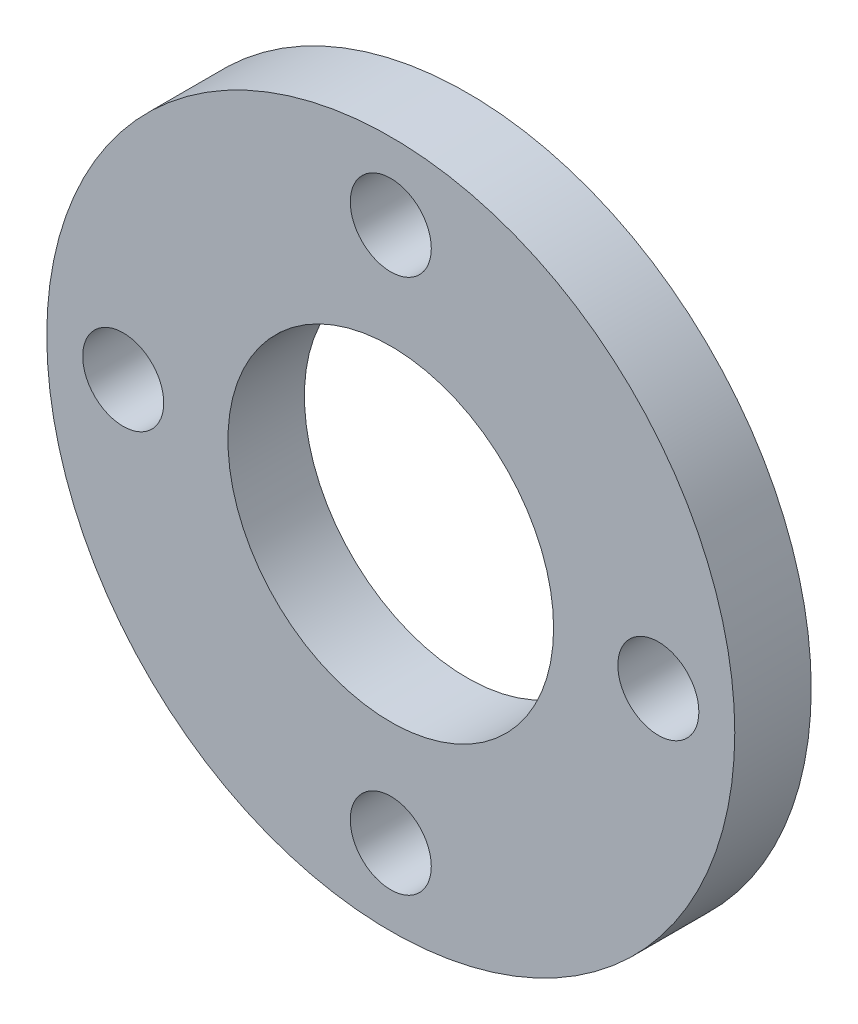
ISO-10303-21;
HEADER;
FILE_DESCRIPTION(('STEP AP214'),'2;1');
FILE_NAME('part.step','',(''),(''),'','','');
FILE_SCHEMA(('AUTOMOTIVE_DESIGN { 1 0 10303 214 1 1 1 1 }'));
ENDSEC;
DATA;
#1=APPLICATION_CONTEXT('core data for automotive mechanical design processes');
#2=APPLICATION_PROTOCOL_DEFINITION('international standard','automotive_design',2000,#1);
#3=PRODUCT_CONTEXT('',#1,'mechanical');
#4=PRODUCT('Part','Part','',(#3));
#5=PRODUCT_RELATED_PRODUCT_CATEGORY('part','',(#4));
#6=PRODUCT_DEFINITION_FORMATION('','',#4);
#7=PRODUCT_DEFINITION_CONTEXT('part definition',#1,'design');
#8=PRODUCT_DEFINITION('design','',#6,#7);
#9=PRODUCT_DEFINITION_SHAPE('','',#8);
#10=(LENGTH_UNIT() NAMED_UNIT(*) SI_UNIT(.MILLI.,.METRE.));
#11=(NAMED_UNIT(*) PLANE_ANGLE_UNIT() SI_UNIT($,.RADIAN.));
#12=(NAMED_UNIT(*) SI_UNIT($,.STERADIAN.) SOLID_ANGLE_UNIT());
#13=UNCERTAINTY_MEASURE_WITH_UNIT(LENGTH_MEASURE(1.E-05),#10,'distance_accuracy_value','');
#14=(GEOMETRIC_REPRESENTATION_CONTEXT(3) GLOBAL_UNCERTAINTY_ASSIGNED_CONTEXT((#13)) GLOBAL_UNIT_ASSIGNED_CONTEXT((#10,
#11,#12)) REPRESENTATION_CONTEXT('',''));
#15=CARTESIAN_POINT('',(0.,0.,0.));
#16=DIRECTION('',(0.,0.,1.));
#17=DIRECTION('',(1.,0.,0.));
#18=AXIS2_PLACEMENT_3D('',#15,#16,#17);
#19=CARTESIAN_POINT('',(0.,35.,10.));
#20=DIRECTION('',(0.,0.,-1.));
#21=DIRECTION('',(-1.,0.,0.));
#22=AXIS2_PLACEMENT_3D('',#19,#20,#21);
#23=CYLINDRICAL_SURFACE('',#22,5.3);
#24=CARTESIAN_POINT('',(0.,35.,10.));
#25=DIRECTION('',(0.,0.,1.));
#26=DIRECTION('',(1.,0.,0.));
#27=AXIS2_PLACEMENT_3D('',#24,#25,#26);
#28=CIRCLE('',#27,5.3);
#29=CARTESIAN_POINT('',(5.3,35.,10.));
#30=VERTEX_POINT('',#29);
#31=EDGE_CURVE('E48',#30,#30,#28,.T.);
#32=ORIENTED_EDGE('',*,*,#31,.T.);
#33=EDGE_LOOP('',(#32));
#34=FACE_BOUND('',#33,.T.);
#35=CARTESIAN_POINT('',(0.,35.,0.));
#36=DIRECTION('',(0.,0.,1.));
#37=DIRECTION('',(1.,0.,0.));
#38=AXIS2_PLACEMENT_3D('',#35,#36,#37);
#39=CIRCLE('',#38,5.3);
#40=CARTESIAN_POINT('',(5.3,35.,0.));
#41=VERTEX_POINT('',#40);
#42=EDGE_CURVE('E73',#41,#41,#39,.T.);
#43=ORIENTED_EDGE('',*,*,#42,.F.);
#44=EDGE_LOOP('',(#43));
#45=FACE_BOUND('',#44,.T.);
#46=ADVANCED_FACE('F39',(#34,#45),#23,.F.);
#47=CARTESIAN_POINT('',(35.,0.,10.));
#48=DIRECTION('',(0.,0.,-1.));
#49=DIRECTION('',(-1.,0.,0.));
#50=AXIS2_PLACEMENT_3D('',#47,#48,#49);
#51=CYLINDRICAL_SURFACE('',#50,5.3);
#52=CARTESIAN_POINT('',(35.,0.,10.));
#53=DIRECTION('',(0.,0.,1.));
#54=DIRECTION('',(1.,0.,0.));
#55=AXIS2_PLACEMENT_3D('',#52,#53,#54);
#56=CIRCLE('',#55,5.3);
#57=CARTESIAN_POINT('',(40.3,0.,10.));
#58=VERTEX_POINT('',#57);
#59=EDGE_CURVE('E54',#58,#58,#56,.T.);
#60=ORIENTED_EDGE('',*,*,#59,.T.);
#61=EDGE_LOOP('',(#60));
#62=FACE_BOUND('',#61,.T.);
#63=CARTESIAN_POINT('',(35.,0.,0.));
#64=DIRECTION('',(0.,0.,1.));
#65=DIRECTION('',(1.,0.,0.));
#66=AXIS2_PLACEMENT_3D('',#63,#64,#65);
#67=CIRCLE('',#66,5.3);
#68=CARTESIAN_POINT('',(40.3,0.,0.));
#69=VERTEX_POINT('',#68);
#70=EDGE_CURVE('E70',#69,#69,#67,.T.);
#71=ORIENTED_EDGE('',*,*,#70,.F.);
#72=EDGE_LOOP('',(#71));
#73=FACE_BOUND('',#72,.T.);
#74=ADVANCED_FACE('F100',(#62,#73),#51,.F.);
#75=CARTESIAN_POINT('',(0.,-35.,10.));
#76=DIRECTION('',(0.,0.,-1.));
#77=DIRECTION('',(-1.,0.,0.));
#78=AXIS2_PLACEMENT_3D('',#75,#76,#77);
#79=CYLINDRICAL_SURFACE('',#78,5.3);
#80=CARTESIAN_POINT('',(0.,-35.,10.));
#81=DIRECTION('',(0.,0.,1.));
#82=DIRECTION('',(1.,0.,0.));
#83=AXIS2_PLACEMENT_3D('',#80,#81,#82);
#84=CIRCLE('',#83,5.3);
#85=CARTESIAN_POINT('',(5.3,-35.,10.));
#86=VERTEX_POINT('',#85);
#87=EDGE_CURVE('E91',#86,#86,#84,.T.);
#88=ORIENTED_EDGE('',*,*,#87,.T.);
#89=EDGE_LOOP('',(#88));
#90=FACE_BOUND('',#89,.T.);
#91=CARTESIAN_POINT('',(0.,-35.,0.));
#92=DIRECTION('',(0.,0.,1.));
#93=DIRECTION('',(1.,0.,0.));
#94=AXIS2_PLACEMENT_3D('',#91,#92,#93);
#95=CIRCLE('',#94,5.3);
#96=CARTESIAN_POINT('',(5.3,-35.,0.));
#97=VERTEX_POINT('',#96);
#98=EDGE_CURVE('E66',#97,#97,#95,.T.);
#99=ORIENTED_EDGE('',*,*,#98,.F.);
#100=EDGE_LOOP('',(#99));
#101=FACE_BOUND('',#100,.T.);
#102=ADVANCED_FACE('F118',(#90,#101),#79,.F.);
#103=CARTESIAN_POINT('',(-35.,0.,10.));
#104=DIRECTION('',(0.,0.,-1.));
#105=DIRECTION('',(-1.,0.,0.));
#106=AXIS2_PLACEMENT_3D('',#103,#104,#105);
#107=CYLINDRICAL_SURFACE('',#106,5.3);
#108=CARTESIAN_POINT('',(-35.,0.,10.));
#109=DIRECTION('',(0.,0.,1.));
#110=DIRECTION('',(1.,0.,0.));
#111=AXIS2_PLACEMENT_3D('',#108,#109,#110);
#112=CIRCLE('',#111,5.3);
#113=CARTESIAN_POINT('',(-29.7,0.,10.));
#114=VERTEX_POINT('',#113);
#115=EDGE_CURVE('E85',#114,#114,#112,.T.);
#116=ORIENTED_EDGE('',*,*,#115,.T.);
#117=EDGE_LOOP('',(#116));
#118=FACE_BOUND('',#117,.T.);
#119=CARTESIAN_POINT('',(-35.,0.,0.));
#120=DIRECTION('',(0.,0.,1.));
#121=DIRECTION('',(1.,0.,0.));
#122=AXIS2_PLACEMENT_3D('',#119,#120,#121);
#123=CIRCLE('',#122,5.3);
#124=CARTESIAN_POINT('',(-29.7,0.,0.));
#125=VERTEX_POINT('',#124);
#126=EDGE_CURVE('E62',#125,#125,#123,.T.);
#127=ORIENTED_EDGE('',*,*,#126,.F.);
#128=EDGE_LOOP('',(#127));
#129=FACE_BOUND('',#128,.T.);
#130=ADVANCED_FACE('F124',(#118,#129),#107,.F.);
#131=CARTESIAN_POINT('',(0.,0.,10.));
#132=DIRECTION('',(0.,0.,-1.));
#133=DIRECTION('',(-1.,0.,0.));
#134=AXIS2_PLACEMENT_3D('',#131,#132,#133);
#135=CYLINDRICAL_SURFACE('',#134,21.3);
#136=CARTESIAN_POINT('',(0.,0.,10.));
#137=DIRECTION('',(0.,0.,1.));
#138=DIRECTION('',(1.,0.,0.));
#139=AXIS2_PLACEMENT_3D('',#136,#137,#138);
#140=CIRCLE('',#139,21.3);
#141=CARTESIAN_POINT('',(21.3,0.,10.));
#142=VERTEX_POINT('',#141);
#143=EDGE_CURVE('E80',#142,#142,#140,.T.);
#144=ORIENTED_EDGE('',*,*,#143,.T.);
#145=EDGE_LOOP('',(#144));
#146=FACE_BOUND('',#145,.T.);
#147=CARTESIAN_POINT('',(0.,0.,0.));
#148=DIRECTION('',(0.,0.,1.));
#149=DIRECTION('',(1.,0.,0.));
#150=AXIS2_PLACEMENT_3D('',#147,#148,#149);
#151=CIRCLE('',#150,21.3);
#152=CARTESIAN_POINT('',(21.3,0.,0.));
#153=VERTEX_POINT('',#152);
#154=EDGE_CURVE('E58',#153,#153,#151,.T.);
#155=ORIENTED_EDGE('',*,*,#154,.F.);
#156=EDGE_LOOP('',(#155));
#157=FACE_BOUND('',#156,.T.);
#158=ADVANCED_FACE('F41',(#146,#157),#135,.F.);
#159=CARTESIAN_POINT('',(0.,0.,10.));
#160=DIRECTION('',(0.,0.,-1.));
#161=DIRECTION('',(-1.,0.,0.));
#162=AXIS2_PLACEMENT_3D('',#159,#160,#161);
#163=CYLINDRICAL_SURFACE('',#162,45.);
#164=CARTESIAN_POINT('',(0.,0.,10.));
#165=DIRECTION('',(0.,0.,1.));
#166=DIRECTION('',(1.,0.,0.));
#167=AXIS2_PLACEMENT_3D('',#164,#165,#166);
#168=CIRCLE('',#167,45.);
#169=CARTESIAN_POINT('',(45.,0.,10.));
#170=VERTEX_POINT('',#169);
#171=EDGE_CURVE('E10',#170,#170,#168,.T.);
#172=ORIENTED_EDGE('',*,*,#171,.F.);
#173=EDGE_LOOP('',(#172));
#174=FACE_BOUND('',#173,.T.);
#175=CARTESIAN_POINT('',(0.,0.,0.));
#176=DIRECTION('',(0.,0.,1.));
#177=DIRECTION('',(1.,0.,0.));
#178=AXIS2_PLACEMENT_3D('',#175,#176,#177);
#179=CIRCLE('',#178,45.);
#180=CARTESIAN_POINT('',(45.,0.,0.));
#181=VERTEX_POINT('',#180);
#182=EDGE_CURVE('E43',#181,#181,#179,.T.);
#183=ORIENTED_EDGE('',*,*,#182,.T.);
#184=EDGE_LOOP('',(#183));
#185=FACE_BOUND('',#184,.T.);
#186=ADVANCED_FACE('F107',(#174,#185),#163,.T.);
#187=CARTESIAN_POINT('',(0.,0.,10.));
#188=DIRECTION('',(0.,0.,1.));
#189=DIRECTION('',(1.,0.,0.));
#190=AXIS2_PLACEMENT_3D('',#187,#188,#189);
#191=PLANE('',#190);
#192=ORIENTED_EDGE('',*,*,#143,.F.);
#193=EDGE_LOOP('',(#192));
#194=FACE_BOUND('',#193,.T.);
#195=ORIENTED_EDGE('',*,*,#115,.F.);
#196=EDGE_LOOP('',(#195));
#197=FACE_BOUND('',#196,.T.);
#198=ORIENTED_EDGE('',*,*,#87,.F.);
#199=EDGE_LOOP('',(#198));
#200=FACE_BOUND('',#199,.T.);
#201=ORIENTED_EDGE('',*,*,#59,.F.);
#202=EDGE_LOOP('',(#201));
#203=FACE_BOUND('',#202,.T.);
#204=ORIENTED_EDGE('',*,*,#31,.F.);
#205=EDGE_LOOP('',(#204));
#206=FACE_BOUND('',#205,.T.);
#207=ORIENTED_EDGE('',*,*,#171,.T.);
#208=EDGE_LOOP('',(#207));
#209=FACE_BOUND('',#208,.T.);
#210=ADVANCED_FACE('F103',(#194,#197,#200,#203,#206,#209),#191,.T.);
#211=CARTESIAN_POINT('',(0.,0.,0.));
#212=DIRECTION('',(0.,0.,1.));
#213=DIRECTION('',(1.,0.,0.));
#214=AXIS2_PLACEMENT_3D('',#211,#212,#213);
#215=PLANE('',#214);
#216=ORIENTED_EDGE('',*,*,#154,.T.);
#217=EDGE_LOOP('',(#216));
#218=FACE_BOUND('',#217,.T.);
#219=ORIENTED_EDGE('',*,*,#126,.T.);
#220=EDGE_LOOP('',(#219));
#221=FACE_BOUND('',#220,.T.);
#222=ORIENTED_EDGE('',*,*,#98,.T.);
#223=EDGE_LOOP('',(#222));
#224=FACE_BOUND('',#223,.T.);
#225=ORIENTED_EDGE('',*,*,#70,.T.);
#226=EDGE_LOOP('',(#225));
#227=FACE_BOUND('',#226,.T.);
#228=ORIENTED_EDGE('',*,*,#42,.T.);
#229=EDGE_LOOP('',(#228));
#230=FACE_BOUND('',#229,.T.);
#231=ORIENTED_EDGE('',*,*,#182,.F.);
#232=EDGE_LOOP('',(#231));
#233=FACE_BOUND('',#232,.T.);
#234=ADVANCED_FACE('F106',(#218,#221,#224,#227,#230,#233),#215,.F.);
#235=CLOSED_SHELL('',(#46,#74,#102,#130,#158,#186,#210,#234));
#236=MANIFOLD_SOLID_BREP('B2',#235);
#237=ADVANCED_BREP_SHAPE_REPRESENTATION('',(#18,#236),#14);
#238=SHAPE_DEFINITION_REPRESENTATION(#9,#237);
ENDSEC;
END-ISO-10303-21;
